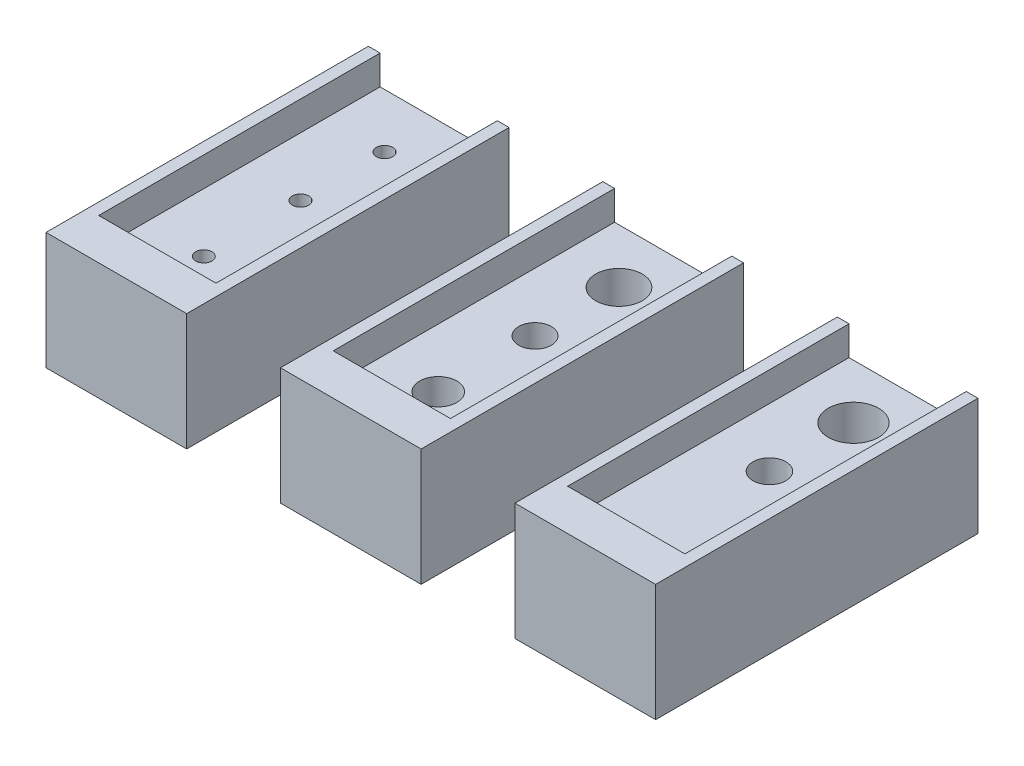
ISO-10303-21;
HEADER;
FILE_DESCRIPTION(('STEP AP214'),'2;1');
FILE_NAME('part.step','',(''),(''),'','','');
FILE_SCHEMA(('AUTOMOTIVE_DESIGN { 1 0 10303 214 1 1 1 1 }'));
ENDSEC;
DATA;
#1=APPLICATION_CONTEXT('core data for automotive mechanical design processes');
#2=APPLICATION_PROTOCOL_DEFINITION('international standard','automotive_design',2000,#1);
#3=PRODUCT_CONTEXT('',#1,'mechanical');
#4=PRODUCT('Part','Part','',(#3));
#5=PRODUCT_RELATED_PRODUCT_CATEGORY('part','',(#4));
#6=PRODUCT_DEFINITION_FORMATION('','',#4);
#7=PRODUCT_DEFINITION_CONTEXT('part definition',#1,'design');
#8=PRODUCT_DEFINITION('design','',#6,#7);
#9=PRODUCT_DEFINITION_SHAPE('','',#8);
#10=(LENGTH_UNIT() NAMED_UNIT(*) SI_UNIT(.MILLI.,.METRE.));
#11=(NAMED_UNIT(*) PLANE_ANGLE_UNIT() SI_UNIT($,.RADIAN.));
#12=(NAMED_UNIT(*) SI_UNIT($,.STERADIAN.) SOLID_ANGLE_UNIT());
#13=UNCERTAINTY_MEASURE_WITH_UNIT(LENGTH_MEASURE(1.E-05),#10,'distance_accuracy_value','');
#14=(GEOMETRIC_REPRESENTATION_CONTEXT(3) GLOBAL_UNCERTAINTY_ASSIGNED_CONTEXT((#13)) GLOBAL_UNIT_ASSIGNED_CONTEXT((#10,
#11,#12)) REPRESENTATION_CONTEXT('',''));
#15=CARTESIAN_POINT('',(0.,0.,0.));
#16=DIRECTION('',(0.,0.,1.));
#17=DIRECTION('',(1.,0.,0.));
#18=AXIS2_PLACEMENT_3D('',#15,#16,#17);
#19=CARTESIAN_POINT('',(0.,15.,0.));
#20=DIRECTION('',(0.,-1.,0.));
#21=DIRECTION('',(0.,0.,-1.));
#22=AXIS2_PLACEMENT_3D('',#19,#20,#21);
#23=PLANE('',#22);
#24=CARTESIAN_POINT('',(-30.,15.,-14.92));
#25=DIRECTION('',(0.,1.,0.));
#26=DIRECTION('',(0.,0.,1.));
#27=AXIS2_PLACEMENT_3D('',#24,#25,#26);
#28=CIRCLE('',#27,1.385);
#29=CARTESIAN_POINT('',(-30.,15.,-13.535));
#30=VERTEX_POINT('',#29);
#31=EDGE_CURVE('E173',#30,#30,#28,.T.);
#32=ORIENTED_EDGE('',*,*,#31,.F.);
#33=EDGE_LOOP('',(#32));
#34=FACE_BOUND('',#33,.T.);
#35=CARTESIAN_POINT('',(-30.,15.,-31.42));
#36=DIRECTION('',(0.,1.,0.));
#37=DIRECTION('',(0.,0.,1.));
#38=AXIS2_PLACEMENT_3D('',#35,#36,#37);
#39=CIRCLE('',#38,1.385);
#40=CARTESIAN_POINT('',(-30.,15.,-30.035));
#41=VERTEX_POINT('',#40);
#42=EDGE_CURVE('E184',#41,#41,#39,.T.);
#43=ORIENTED_EDGE('',*,*,#42,.F.);
#44=EDGE_LOOP('',(#43));
#45=FACE_BOUND('',#44,.T.);
#46=CARTESIAN_POINT('',(-30.,15.,-45.75));
#47=DIRECTION('',(0.,1.,0.));
#48=DIRECTION('',(0.,0.,1.));
#49=AXIS2_PLACEMENT_3D('',#46,#47,#48);
#50=CIRCLE('',#49,1.385);
#51=CARTESIAN_POINT('',(-30.,15.,-44.365));
#52=VERTEX_POINT('',#51);
#53=EDGE_CURVE('E178',#52,#52,#50,.T.);
#54=ORIENTED_EDGE('',*,*,#53,.F.);
#55=EDGE_LOOP('',(#54));
#56=FACE_BOUND('',#55,.T.);
#57=DIRECTION('',(-1.,0.,0.));
#58=VECTOR('',#57,1.);
#59=CARTESIAN_POINT('',(-40.,15.,-6.99999999999999));
#60=LINE('',#59,#58);
#61=CARTESIAN_POINT('',(-20.,15.,-6.99999999999999));
#62=VERTEX_POINT('',#61);
#63=CARTESIAN_POINT('',(-40.,15.,-6.99999999999999));
#64=VERTEX_POINT('',#63);
#65=EDGE_CURVE('E149',#62,#64,#60,.T.);
#66=ORIENTED_EDGE('',*,*,#65,.F.);
#67=DIRECTION('',(0.,0.,-1.));
#68=VECTOR('',#67,1.);
#69=CARTESIAN_POINT('',(-20.,15.,0.));
#70=LINE('',#69,#68);
#71=CARTESIAN_POINT('',(-20.,15.,-55.));
#72=VERTEX_POINT('',#71);
#73=EDGE_CURVE('E53',#62,#72,#70,.T.);
#74=ORIENTED_EDGE('',*,*,#73,.T.);
#75=DIRECTION('',(-1.,0.,0.));
#76=VECTOR('',#75,1.);
#77=CARTESIAN_POINT('',(-40.,15.,-55.));
#78=LINE('',#77,#76);
#79=CARTESIAN_POINT('',(-40.,15.,-55.));
#80=VERTEX_POINT('',#79);
#81=EDGE_CURVE('E12',#72,#80,#78,.T.);
#82=ORIENTED_EDGE('',*,*,#81,.T.);
#83=DIRECTION('',(0.,0.,1.));
#84=VECTOR('',#83,1.);
#85=CARTESIAN_POINT('',(-40.,15.,0.));
#86=LINE('',#85,#84);
#87=EDGE_CURVE('E192',#80,#64,#86,.T.);
#88=ORIENTED_EDGE('',*,*,#87,.T.);
#89=EDGE_LOOP('',(#66,#74,#82,#88));
#90=FACE_BOUND('',#89,.T.);
#91=ADVANCED_FACE('F44',(#34,#45,#56,#90),#23,.F.);
#92=CARTESIAN_POINT('',(-40.,15.,0.));
#93=DIRECTION('',(0.,0.,-1.));
#94=DIRECTION('',(-1.,0.,0.));
#95=AXIS2_PLACEMENT_3D('',#92,#93,#94);
#96=PLANE('',#95);
#97=DIRECTION('',(1.,0.,0.));
#98=VECTOR('',#97,1.);
#99=CARTESIAN_POINT('',(-40.,0.,0.));
#100=LINE('',#99,#98);
#101=CARTESIAN_POINT('',(-42.,0.,0.));
#102=VERTEX_POINT('',#101);
#103=CARTESIAN_POINT('',(-18.,0.,0.));
#104=VERTEX_POINT('',#103);
#105=EDGE_CURVE('E177',#102,#104,#100,.T.);
#106=ORIENTED_EDGE('',*,*,#105,.T.);
#107=DIRECTION('',(0.,-1.,0.));
#108=VECTOR('',#107,1.);
#109=CARTESIAN_POINT('',(-18.,75.0363516232681,0.));
#110=LINE('',#109,#108);
#111=CARTESIAN_POINT('',(-18.,20.,0.));
#112=VERTEX_POINT('',#111);
#113=EDGE_CURVE('E123',#112,#104,#110,.T.);
#114=ORIENTED_EDGE('',*,*,#113,.F.);
#115=DIRECTION('',(1.,0.,0.));
#116=VECTOR('',#115,1.);
#117=CARTESIAN_POINT('',(-40.,20.,0.));
#118=LINE('',#117,#116);
#119=CARTESIAN_POINT('',(-42.,20.,0.));
#120=VERTEX_POINT('',#119);
#121=EDGE_CURVE('E119',#120,#112,#118,.T.);
#122=ORIENTED_EDGE('',*,*,#121,.F.);
#123=DIRECTION('',(0.,-1.,0.));
#124=VECTOR('',#123,1.);
#125=CARTESIAN_POINT('',(-42.,75.0363516232681,0.));
#126=LINE('',#125,#124);
#127=EDGE_CURVE('E146',#120,#102,#126,.T.);
#128=ORIENTED_EDGE('',*,*,#127,.T.);
#129=EDGE_LOOP('',(#106,#114,#122,#128));
#130=FACE_BOUND('',#129,.T.);
#131=ADVANCED_FACE('F46',(#130),#96,.F.);
#132=CARTESIAN_POINT('',(-40.,15.,-55.));
#133=DIRECTION('',(0.,0.,1.));
#134=DIRECTION('',(1.,0.,0.));
#135=AXIS2_PLACEMENT_3D('',#132,#133,#134);
#136=PLANE('',#135);
#137=DIRECTION('',(-1.,0.,0.));
#138=VECTOR('',#137,1.);
#139=CARTESIAN_POINT('',(-40.,0.,-55.));
#140=LINE('',#139,#138);
#141=CARTESIAN_POINT('',(-18.,0.,-55.));
#142=VERTEX_POINT('',#141);
#143=CARTESIAN_POINT('',(-42.,0.,-55.));
#144=VERTEX_POINT('',#143);
#145=EDGE_CURVE('E48',#142,#144,#140,.T.);
#146=ORIENTED_EDGE('',*,*,#145,.T.);
#147=DIRECTION('',(0.,-1.,0.));
#148=VECTOR('',#147,1.);
#149=CARTESIAN_POINT('',(-42.,75.0363516232681,-55.));
#150=LINE('',#149,#148);
#151=CARTESIAN_POINT('',(-42.,20.,-55.));
#152=VERTEX_POINT('',#151);
#153=EDGE_CURVE('E154',#152,#144,#150,.T.);
#154=ORIENTED_EDGE('',*,*,#153,.F.);
#155=DIRECTION('',(1.,0.,0.));
#156=VECTOR('',#155,1.);
#157=CARTESIAN_POINT('',(-40.,20.,-55.));
#158=LINE('',#157,#156);
#159=CARTESIAN_POINT('',(-40.,20.,-55.));
#160=VERTEX_POINT('',#159);
#161=EDGE_CURVE('E151',#152,#160,#158,.T.);
#162=ORIENTED_EDGE('',*,*,#161,.T.);
#163=DIRECTION('',(0.,-1.,0.));
#164=VECTOR('',#163,1.);
#165=CARTESIAN_POINT('',(-40.,75.0363516232681,-55.));
#166=LINE('',#165,#164);
#167=EDGE_CURVE('E150',#160,#80,#166,.T.);
#168=ORIENTED_EDGE('',*,*,#167,.T.);
#169=ORIENTED_EDGE('',*,*,#81,.F.);
#170=DIRECTION('',(0.,-1.,0.));
#171=VECTOR('',#170,1.);
#172=CARTESIAN_POINT('',(-20.,75.0363516232681,-55.));
#173=LINE('',#172,#171);
#174=CARTESIAN_POINT('',(-20.,20.,-55.));
#175=VERTEX_POINT('',#174);
#176=EDGE_CURVE('E135',#175,#72,#173,.T.);
#177=ORIENTED_EDGE('',*,*,#176,.F.);
#178=DIRECTION('',(1.,0.,0.));
#179=VECTOR('',#178,1.);
#180=CARTESIAN_POINT('',(-20.,20.,-55.));
#181=LINE('',#180,#179);
#182=CARTESIAN_POINT('',(-18.,20.,-55.));
#183=VERTEX_POINT('',#182);
#184=EDGE_CURVE('E116',#175,#183,#181,.T.);
#185=ORIENTED_EDGE('',*,*,#184,.T.);
#186=DIRECTION('',(0.,-1.,0.));
#187=VECTOR('',#186,1.);
#188=CARTESIAN_POINT('',(-18.,75.0363516232681,-55.));
#189=LINE('',#188,#187);
#190=EDGE_CURVE('E124',#183,#142,#189,.T.);
#191=ORIENTED_EDGE('',*,*,#190,.T.);
#192=EDGE_LOOP('',(#146,#154,#162,#168,#169,#177,#185,#191));
#193=FACE_BOUND('',#192,.T.);
#194=ADVANCED_FACE('F133',(#193),#136,.F.);
#195=CARTESIAN_POINT('',(0.,0.,0.));
#196=DIRECTION('',(0.,-1.,0.));
#197=DIRECTION('',(0.,0.,-1.));
#198=AXIS2_PLACEMENT_3D('',#195,#196,#197);
#199=PLANE('',#198);
#200=CARTESIAN_POINT('',(-30.,0.,-45.75));
#201=DIRECTION('',(0.,1.,0.));
#202=DIRECTION('',(0.,0.,1.));
#203=AXIS2_PLACEMENT_3D('',#200,#201,#202);
#204=CIRCLE('',#203,1.385);
#205=CARTESIAN_POINT('',(-30.,0.,-44.365));
#206=VERTEX_POINT('',#205);
#207=EDGE_CURVE('E174',#206,#206,#204,.T.);
#208=ORIENTED_EDGE('',*,*,#207,.T.);
#209=EDGE_LOOP('',(#208));
#210=FACE_BOUND('',#209,.T.);
#211=CARTESIAN_POINT('',(-30.,0.,-31.42));
#212=DIRECTION('',(0.,1.,0.));
#213=DIRECTION('',(0.,0.,1.));
#214=AXIS2_PLACEMENT_3D('',#211,#212,#213);
#215=CIRCLE('',#214,1.385);
#216=CARTESIAN_POINT('',(-30.,0.,-30.035));
#217=VERTEX_POINT('',#216);
#218=EDGE_CURVE('E181',#217,#217,#215,.T.);
#219=ORIENTED_EDGE('',*,*,#218,.T.);
#220=EDGE_LOOP('',(#219));
#221=FACE_BOUND('',#220,.T.);
#222=CARTESIAN_POINT('',(-30.,0.,-14.92));
#223=DIRECTION('',(0.,1.,0.));
#224=DIRECTION('',(0.,0.,1.));
#225=AXIS2_PLACEMENT_3D('',#222,#223,#224);
#226=CIRCLE('',#225,1.385);
#227=CARTESIAN_POINT('',(-30.,0.,-13.535));
#228=VERTEX_POINT('',#227);
#229=EDGE_CURVE('E187',#228,#228,#226,.T.);
#230=ORIENTED_EDGE('',*,*,#229,.T.);
#231=EDGE_LOOP('',(#230));
#232=FACE_BOUND('',#231,.T.);
#233=ORIENTED_EDGE('',*,*,#105,.F.);
#234=DIRECTION('',(0.,0.,-1.));
#235=VECTOR('',#234,1.);
#236=CARTESIAN_POINT('',(-42.,0.,0.));
#237=LINE('',#236,#235);
#238=EDGE_CURVE('E143',#102,#144,#237,.T.);
#239=ORIENTED_EDGE('',*,*,#238,.T.);
#240=ORIENTED_EDGE('',*,*,#145,.F.);
#241=DIRECTION('',(0.,0.,1.));
#242=VECTOR('',#241,1.);
#243=CARTESIAN_POINT('',(-18.,0.,0.));
#244=LINE('',#243,#242);
#245=EDGE_CURVE('E130',#142,#104,#244,.T.);
#246=ORIENTED_EDGE('',*,*,#245,.T.);
#247=EDGE_LOOP('',(#233,#239,#240,#246));
#248=FACE_BOUND('',#247,.T.);
#249=ADVANCED_FACE('F201',(#210,#221,#232,#248),#199,.T.);
#250=CARTESIAN_POINT('',(-30.,0.,-14.92));
#251=DIRECTION('',(0.,1.,0.));
#252=DIRECTION('',(0.,0.,1.));
#253=AXIS2_PLACEMENT_3D('',#250,#251,#252);
#254=CYLINDRICAL_SURFACE('',#253,1.385);
#255=ORIENTED_EDGE('',*,*,#229,.F.);
#256=EDGE_LOOP('',(#255));
#257=FACE_BOUND('',#256,.T.);
#258=ORIENTED_EDGE('',*,*,#31,.T.);
#259=EDGE_LOOP('',(#258));
#260=FACE_BOUND('',#259,.T.);
#261=ADVANCED_FACE('F227',(#257,#260),#254,.F.);
#262=CARTESIAN_POINT('',(-30.,0.,-31.42));
#263=DIRECTION('',(0.,1.,0.));
#264=DIRECTION('',(0.,0.,1.));
#265=AXIS2_PLACEMENT_3D('',#262,#263,#264);
#266=CYLINDRICAL_SURFACE('',#265,1.385);
#267=ORIENTED_EDGE('',*,*,#218,.F.);
#268=EDGE_LOOP('',(#267));
#269=FACE_BOUND('',#268,.T.);
#270=ORIENTED_EDGE('',*,*,#42,.T.);
#271=EDGE_LOOP('',(#270));
#272=FACE_BOUND('',#271,.T.);
#273=ADVANCED_FACE('F247',(#269,#272),#266,.F.);
#274=CARTESIAN_POINT('',(-30.,0.,-45.75));
#275=DIRECTION('',(0.,1.,0.));
#276=DIRECTION('',(0.,0.,1.));
#277=AXIS2_PLACEMENT_3D('',#274,#275,#276);
#278=CYLINDRICAL_SURFACE('',#277,1.385);
#279=ORIENTED_EDGE('',*,*,#207,.F.);
#280=EDGE_LOOP('',(#279));
#281=FACE_BOUND('',#280,.T.);
#282=ORIENTED_EDGE('',*,*,#53,.T.);
#283=EDGE_LOOP('',(#282));
#284=FACE_BOUND('',#283,.T.);
#285=ADVANCED_FACE('F254',(#281,#284),#278,.F.);
#286=CARTESIAN_POINT('',(-40.,20.,-6.99999999999999));
#287=DIRECTION('',(0.,0.,1.));
#288=DIRECTION('',(1.,0.,0.));
#289=AXIS2_PLACEMENT_3D('',#286,#287,#288);
#290=PLANE('',#289);
#291=ORIENTED_EDGE('',*,*,#65,.T.);
#292=DIRECTION('',(0.,-1.,0.));
#293=VECTOR('',#292,1.);
#294=CARTESIAN_POINT('',(-40.,20.,-6.99999999999999));
#295=LINE('',#294,#293);
#296=CARTESIAN_POINT('',(-40.,20.,-6.99999999999999));
#297=VERTEX_POINT('',#296);
#298=EDGE_CURVE('E68',#297,#64,#295,.T.);
#299=ORIENTED_EDGE('',*,*,#298,.F.);
#300=DIRECTION('',(-1.,0.,0.));
#301=VECTOR('',#300,1.);
#302=CARTESIAN_POINT('',(-40.,20.,-6.99999999999999));
#303=LINE('',#302,#301);
#304=CARTESIAN_POINT('',(-20.,20.,-6.99999999999999));
#305=VERTEX_POINT('',#304);
#306=EDGE_CURVE('E165',#305,#297,#303,.T.);
#307=ORIENTED_EDGE('',*,*,#306,.F.);
#308=DIRECTION('',(0.,-1.,0.));
#309=VECTOR('',#308,1.);
#310=CARTESIAN_POINT('',(-20.,20.,-6.99999999999999));
#311=LINE('',#310,#309);
#312=EDGE_CURVE('E170',#305,#62,#311,.T.);
#313=ORIENTED_EDGE('',*,*,#312,.T.);
#314=EDGE_LOOP('',(#291,#299,#307,#313));
#315=FACE_BOUND('',#314,.T.);
#316=ADVANCED_FACE('F206',(#315),#290,.F.);
#317=CARTESIAN_POINT('',(0.,20.,0.));
#318=DIRECTION('',(0.,1.,0.));
#319=DIRECTION('',(0.,0.,1.));
#320=AXIS2_PLACEMENT_3D('',#317,#318,#319);
#321=PLANE('',#320);
#322=ORIENTED_EDGE('',*,*,#306,.T.);
#323=DIRECTION('',(0.,0.,1.));
#324=VECTOR('',#323,1.);
#325=CARTESIAN_POINT('',(-40.,20.,0.));
#326=LINE('',#325,#324);
#327=EDGE_CURVE('E147',#160,#297,#326,.T.);
#328=ORIENTED_EDGE('',*,*,#327,.F.);
#329=ORIENTED_EDGE('',*,*,#161,.F.);
#330=DIRECTION('',(0.,0.,-1.));
#331=VECTOR('',#330,1.);
#332=CARTESIAN_POINT('',(-42.,20.,0.));
#333=LINE('',#332,#331);
#334=EDGE_CURVE('E155',#120,#152,#333,.T.);
#335=ORIENTED_EDGE('',*,*,#334,.F.);
#336=ORIENTED_EDGE('',*,*,#121,.T.);
#337=DIRECTION('',(0.,0.,1.));
#338=VECTOR('',#337,1.);
#339=CARTESIAN_POINT('',(-18.,20.,0.));
#340=LINE('',#339,#338);
#341=EDGE_CURVE('E110',#183,#112,#340,.T.);
#342=ORIENTED_EDGE('',*,*,#341,.F.);
#343=ORIENTED_EDGE('',*,*,#184,.F.);
#344=DIRECTION('',(0.,0.,-1.));
#345=VECTOR('',#344,1.);
#346=CARTESIAN_POINT('',(-20.,20.,0.));
#347=LINE('',#346,#345);
#348=EDGE_CURVE('E139',#305,#175,#347,.T.);
#349=ORIENTED_EDGE('',*,*,#348,.F.);
#350=EDGE_LOOP('',(#322,#328,#329,#335,#336,#342,#343,#349));
#351=FACE_BOUND('',#350,.T.);
#352=ADVANCED_FACE('F113',(#351),#321,.T.);
#353=CARTESIAN_POINT('',(-42.,75.0363516232681,0.));
#354=DIRECTION('',(-1.,0.,0.));
#355=DIRECTION('',(0.,0.,1.));
#356=AXIS2_PLACEMENT_3D('',#353,#354,#355);
#357=PLANE('',#356);
#358=ORIENTED_EDGE('',*,*,#127,.F.);
#359=ORIENTED_EDGE('',*,*,#334,.T.);
#360=ORIENTED_EDGE('',*,*,#153,.T.);
#361=ORIENTED_EDGE('',*,*,#238,.F.);
#362=EDGE_LOOP('',(#358,#359,#360,#361));
#363=FACE_BOUND('',#362,.T.);
#364=ADVANCED_FACE('F200',(#363),#357,.T.);
#365=CARTESIAN_POINT('',(-40.,75.0363516232681,0.));
#366=DIRECTION('',(1.,0.,0.));
#367=DIRECTION('',(0.,0.,-1.));
#368=AXIS2_PLACEMENT_3D('',#365,#366,#367);
#369=PLANE('',#368);
#370=ORIENTED_EDGE('',*,*,#327,.T.);
#371=ORIENTED_EDGE('',*,*,#298,.T.);
#372=ORIENTED_EDGE('',*,*,#87,.F.);
#373=ORIENTED_EDGE('',*,*,#167,.F.);
#374=EDGE_LOOP('',(#370,#371,#372,#373));
#375=FACE_BOUND('',#374,.T.);
#376=ADVANCED_FACE('F209',(#375),#369,.T.);
#377=CARTESIAN_POINT('',(-20.,75.0363516232681,0.));
#378=DIRECTION('',(-1.,0.,0.));
#379=DIRECTION('',(0.,0.,1.));
#380=AXIS2_PLACEMENT_3D('',#377,#378,#379);
#381=PLANE('',#380);
#382=ORIENTED_EDGE('',*,*,#73,.F.);
#383=ORIENTED_EDGE('',*,*,#312,.F.);
#384=ORIENTED_EDGE('',*,*,#348,.T.);
#385=ORIENTED_EDGE('',*,*,#176,.T.);
#386=EDGE_LOOP('',(#382,#383,#384,#385));
#387=FACE_BOUND('',#386,.T.);
#388=ADVANCED_FACE('F207',(#387),#381,.T.);
#389=CARTESIAN_POINT('',(-18.,75.0363516232681,0.));
#390=DIRECTION('',(1.,0.,0.));
#391=DIRECTION('',(0.,0.,-1.));
#392=AXIS2_PLACEMENT_3D('',#389,#390,#391);
#393=PLANE('',#392);
#394=ORIENTED_EDGE('',*,*,#190,.F.);
#395=ORIENTED_EDGE('',*,*,#341,.T.);
#396=ORIENTED_EDGE('',*,*,#113,.T.);
#397=ORIENTED_EDGE('',*,*,#245,.F.);
#398=EDGE_LOOP('',(#394,#395,#396,#397));
#399=FACE_BOUND('',#398,.T.);
#400=ADVANCED_FACE('F128',(#399),#393,.T.);
#401=CLOSED_SHELL('',(#91,#131,#194,#249,#261,#273,#285,#316,#352,#364,#376,#388,#400));
#402=MANIFOLD_SOLID_BREP('B2',#401);
#403=CARTESIAN_POINT('',(0.,15.,0.));
#404=DIRECTION('',(0.,-1.,0.));
#405=DIRECTION('',(0.,0.,-1.));
#406=AXIS2_PLACEMENT_3D('',#403,#404,#405);
#407=PLANE('',#406);
#408=CARTESIAN_POINT('',(50.,15.,-31.42));
#409=DIRECTION('',(0.,1.,0.));
#410=DIRECTION('',(0.,0.,1.));
#411=AXIS2_PLACEMENT_3D('',#408,#409,#410);
#412=CIRCLE('',#411,2.80670000000001);
#413=CARTESIAN_POINT('',(50.,15.,-28.6133));
#414=VERTEX_POINT('',#413);
#415=EDGE_CURVE('E500',#414,#414,#412,.T.);
#416=ORIENTED_EDGE('',*,*,#415,.F.);
#417=EDGE_LOOP('',(#416));
#418=FACE_BOUND('',#417,.T.);
#419=CARTESIAN_POINT('',(50.,15.,-45.75));
#420=DIRECTION('',(0.,1.,0.));
#421=DIRECTION('',(0.,0.,1.));
#422=AXIS2_PLACEMENT_3D('',#419,#420,#421);
#423=CIRCLE('',#422,4.3053);
#424=CARTESIAN_POINT('',(50.,15.,-41.4447));
#425=VERTEX_POINT('',#424);
#426=EDGE_CURVE('E505',#425,#425,#423,.T.);
#427=ORIENTED_EDGE('',*,*,#426,.F.);
#428=EDGE_LOOP('',(#427));
#429=FACE_BOUND('',#428,.T.);
#430=DIRECTION('',(-1.,0.,0.));
#431=VECTOR('',#430,1.);
#432=CARTESIAN_POINT('',(40.,15.,-6.99999999999999));
#433=LINE('',#432,#431);
#434=CARTESIAN_POINT('',(60.,15.,-6.99999999999999));
#435=VERTEX_POINT('',#434);
#436=CARTESIAN_POINT('',(40.,15.,-6.99999999999999));
#437=VERTEX_POINT('',#436);
#438=EDGE_CURVE('E476',#435,#437,#433,.T.);
#439=ORIENTED_EDGE('',*,*,#438,.F.);
#440=DIRECTION('',(0.,0.,-1.));
#441=VECTOR('',#440,1.);
#442=CARTESIAN_POINT('',(60.,15.,0.));
#443=LINE('',#442,#441);
#444=CARTESIAN_POINT('',(60.,15.,-55.));
#445=VERTEX_POINT('',#444);
#446=EDGE_CURVE('E380',#435,#445,#443,.T.);
#447=ORIENTED_EDGE('',*,*,#446,.T.);
#448=DIRECTION('',(-1.,0.,0.));
#449=VECTOR('',#448,1.);
#450=CARTESIAN_POINT('',(40.,15.,-55.));
#451=LINE('',#450,#449);
#452=CARTESIAN_POINT('',(40.,15.,-55.));
#453=VERTEX_POINT('',#452);
#454=EDGE_CURVE('E42',#445,#453,#451,.T.);
#455=ORIENTED_EDGE('',*,*,#454,.T.);
#456=DIRECTION('',(0.,0.,1.));
#457=VECTOR('',#456,1.);
#458=CARTESIAN_POINT('',(40.,15.,0.));
#459=LINE('',#458,#457);
#460=EDGE_CURVE('E513',#453,#437,#459,.T.);
#461=ORIENTED_EDGE('',*,*,#460,.T.);
#462=EDGE_LOOP('',(#439,#447,#455,#461));
#463=FACE_BOUND('',#462,.T.);
#464=ADVANCED_FACE('F371',(#418,#429,#463),#407,.F.);
#465=CARTESIAN_POINT('',(40.,15.,0.));
#466=DIRECTION('',(0.,0.,-1.));
#467=DIRECTION('',(-1.,0.,0.));
#468=AXIS2_PLACEMENT_3D('',#465,#466,#467);
#469=PLANE('',#468);
#470=DIRECTION('',(1.,0.,0.));
#471=VECTOR('',#470,1.);
#472=CARTESIAN_POINT('',(40.,0.,0.));
#473=LINE('',#472,#471);
#474=CARTESIAN_POINT('',(38.,0.,0.));
#475=VERTEX_POINT('',#474);
#476=CARTESIAN_POINT('',(62.,0.,0.));
#477=VERTEX_POINT('',#476);
#478=EDGE_CURVE('E504',#475,#477,#473,.T.);
#479=ORIENTED_EDGE('',*,*,#478,.T.);
#480=DIRECTION('',(0.,-1.,0.));
#481=VECTOR('',#480,1.);
#482=CARTESIAN_POINT('',(62.,75.0363516232681,0.));
#483=LINE('',#482,#481);
#484=CARTESIAN_POINT('',(62.,20.,0.));
#485=VERTEX_POINT('',#484);
#486=EDGE_CURVE('E450',#485,#477,#483,.T.);
#487=ORIENTED_EDGE('',*,*,#486,.F.);
#488=DIRECTION('',(1.,0.,0.));
#489=VECTOR('',#488,1.);
#490=CARTESIAN_POINT('',(40.,20.,0.));
#491=LINE('',#490,#489);
#492=CARTESIAN_POINT('',(38.,20.,0.));
#493=VERTEX_POINT('',#492);
#494=EDGE_CURVE('E446',#493,#485,#491,.T.);
#495=ORIENTED_EDGE('',*,*,#494,.F.);
#496=DIRECTION('',(0.,-1.,0.));
#497=VECTOR('',#496,1.);
#498=CARTESIAN_POINT('',(38.,75.0363516232681,0.));
#499=LINE('',#498,#497);
#500=EDGE_CURVE('E473',#493,#475,#499,.T.);
#501=ORIENTED_EDGE('',*,*,#500,.T.);
#502=EDGE_LOOP('',(#479,#487,#495,#501));
#503=FACE_BOUND('',#502,.T.);
#504=ADVANCED_FACE('F373',(#503),#469,.F.);
#505=CARTESIAN_POINT('',(40.,15.,-55.));
#506=DIRECTION('',(0.,0.,1.));
#507=DIRECTION('',(1.,0.,0.));
#508=AXIS2_PLACEMENT_3D('',#505,#506,#507);
#509=PLANE('',#508);
#510=DIRECTION('',(-1.,0.,0.));
#511=VECTOR('',#510,1.);
#512=CARTESIAN_POINT('',(40.,0.,-55.));
#513=LINE('',#512,#511);
#514=CARTESIAN_POINT('',(62.,0.,-55.));
#515=VERTEX_POINT('',#514);
#516=CARTESIAN_POINT('',(38.,0.,-55.));
#517=VERTEX_POINT('',#516);
#518=EDGE_CURVE('E375',#515,#517,#513,.T.);
#519=ORIENTED_EDGE('',*,*,#518,.T.);
#520=DIRECTION('',(0.,-1.,0.));
#521=VECTOR('',#520,1.);
#522=CARTESIAN_POINT('',(38.,75.0363516232681,-55.));
#523=LINE('',#522,#521);
#524=CARTESIAN_POINT('',(38.,20.,-55.));
#525=VERTEX_POINT('',#524);
#526=EDGE_CURVE('E481',#525,#517,#523,.T.);
#527=ORIENTED_EDGE('',*,*,#526,.F.);
#528=DIRECTION('',(1.,0.,0.));
#529=VECTOR('',#528,1.);
#530=CARTESIAN_POINT('',(40.,20.,-55.));
#531=LINE('',#530,#529);
#532=CARTESIAN_POINT('',(40.,20.,-55.));
#533=VERTEX_POINT('',#532);
#534=EDGE_CURVE('E478',#525,#533,#531,.T.);
#535=ORIENTED_EDGE('',*,*,#534,.T.);
#536=DIRECTION('',(0.,-1.,0.));
#537=VECTOR('',#536,1.);
#538=CARTESIAN_POINT('',(40.,75.0363516232681,-55.));
#539=LINE('',#538,#537);
#540=EDGE_CURVE('E477',#533,#453,#539,.T.);
#541=ORIENTED_EDGE('',*,*,#540,.T.);
#542=ORIENTED_EDGE('',*,*,#454,.F.);
#543=DIRECTION('',(0.,-1.,0.));
#544=VECTOR('',#543,1.);
#545=CARTESIAN_POINT('',(60.,75.0363516232681,-55.));
#546=LINE('',#545,#544);
#547=CARTESIAN_POINT('',(60.,20.,-55.));
#548=VERTEX_POINT('',#547);
#549=EDGE_CURVE('E462',#548,#445,#546,.T.);
#550=ORIENTED_EDGE('',*,*,#549,.F.);
#551=DIRECTION('',(1.,0.,0.));
#552=VECTOR('',#551,1.);
#553=CARTESIAN_POINT('',(60.,20.,-55.));
#554=LINE('',#553,#552);
#555=CARTESIAN_POINT('',(62.,20.,-55.));
#556=VERTEX_POINT('',#555);
#557=EDGE_CURVE('E443',#548,#556,#554,.T.);
#558=ORIENTED_EDGE('',*,*,#557,.T.);
#559=DIRECTION('',(0.,-1.,0.));
#560=VECTOR('',#559,1.);
#561=CARTESIAN_POINT('',(62.,75.0363516232681,-55.));
#562=LINE('',#561,#560);
#563=EDGE_CURVE('E451',#556,#515,#562,.T.);
#564=ORIENTED_EDGE('',*,*,#563,.T.);
#565=EDGE_LOOP('',(#519,#527,#535,#541,#542,#550,#558,#564));
#566=FACE_BOUND('',#565,.T.);
#567=ADVANCED_FACE('F460',(#566),#509,.F.);
#568=CARTESIAN_POINT('',(0.,0.,0.));
#569=DIRECTION('',(0.,-1.,0.));
#570=DIRECTION('',(0.,0.,-1.));
#571=AXIS2_PLACEMENT_3D('',#568,#569,#570);
#572=PLANE('',#571);
#573=CARTESIAN_POINT('',(50.,0.,-45.75));
#574=DIRECTION('',(0.,1.,0.));
#575=DIRECTION('',(0.,0.,1.));
#576=AXIS2_PLACEMENT_3D('',#573,#574,#575);
#577=CIRCLE('',#576,4.3053);
#578=CARTESIAN_POINT('',(50.,0.,-41.4447));
#579=VERTEX_POINT('',#578);
#580=EDGE_CURVE('E501',#579,#579,#577,.T.);
#581=ORIENTED_EDGE('',*,*,#580,.T.);
#582=EDGE_LOOP('',(#581));
#583=FACE_BOUND('',#582,.T.);
#584=CARTESIAN_POINT('',(50.,0.,-31.42));
#585=DIRECTION('',(0.,1.,0.));
#586=DIRECTION('',(0.,0.,1.));
#587=AXIS2_PLACEMENT_3D('',#584,#585,#586);
#588=CIRCLE('',#587,2.80670000000001);
#589=CARTESIAN_POINT('',(50.,0.,-28.6133));
#590=VERTEX_POINT('',#589);
#591=EDGE_CURVE('E508',#590,#590,#588,.T.);
#592=ORIENTED_EDGE('',*,*,#591,.T.);
#593=EDGE_LOOP('',(#592));
#594=FACE_BOUND('',#593,.T.);
#595=ORIENTED_EDGE('',*,*,#478,.F.);
#596=DIRECTION('',(0.,0.,-1.));
#597=VECTOR('',#596,1.);
#598=CARTESIAN_POINT('',(38.,0.,0.));
#599=LINE('',#598,#597);
#600=EDGE_CURVE('E470',#475,#517,#599,.T.);
#601=ORIENTED_EDGE('',*,*,#600,.T.);
#602=ORIENTED_EDGE('',*,*,#518,.F.);
#603=DIRECTION('',(0.,0.,1.));
#604=VECTOR('',#603,1.);
#605=CARTESIAN_POINT('',(62.,0.,0.));
#606=LINE('',#605,#604);
#607=EDGE_CURVE('E457',#515,#477,#606,.T.);
#608=ORIENTED_EDGE('',*,*,#607,.T.);
#609=EDGE_LOOP('',(#595,#601,#602,#608));
#610=FACE_BOUND('',#609,.T.);
#611=ADVANCED_FACE('F522',(#583,#594,#610),#572,.T.);
#612=CARTESIAN_POINT('',(50.,0.,-31.42));
#613=DIRECTION('',(0.,1.,0.));
#614=DIRECTION('',(0.,0.,1.));
#615=AXIS2_PLACEMENT_3D('',#612,#613,#614);
#616=CYLINDRICAL_SURFACE('',#615,2.80670000000001);
#617=ORIENTED_EDGE('',*,*,#591,.F.);
#618=EDGE_LOOP('',(#617));
#619=FACE_BOUND('',#618,.T.);
#620=ORIENTED_EDGE('',*,*,#415,.T.);
#621=EDGE_LOOP('',(#620));
#622=FACE_BOUND('',#621,.T.);
#623=ADVANCED_FACE('F548',(#619,#622),#616,.F.);
#624=CARTESIAN_POINT('',(50.,0.,-45.75));
#625=DIRECTION('',(0.,1.,0.));
#626=DIRECTION('',(0.,0.,1.));
#627=AXIS2_PLACEMENT_3D('',#624,#625,#626);
#628=CYLINDRICAL_SURFACE('',#627,4.3053);
#629=ORIENTED_EDGE('',*,*,#580,.F.);
#630=EDGE_LOOP('',(#629));
#631=FACE_BOUND('',#630,.T.);
#632=ORIENTED_EDGE('',*,*,#426,.T.);
#633=EDGE_LOOP('',(#632));
#634=FACE_BOUND('',#633,.T.);
#635=ADVANCED_FACE('F568',(#631,#634),#628,.F.);
#636=CARTESIAN_POINT('',(40.,20.,-6.99999999999999));
#637=DIRECTION('',(0.,0.,1.));
#638=DIRECTION('',(1.,0.,0.));
#639=AXIS2_PLACEMENT_3D('',#636,#637,#638);
#640=PLANE('',#639);
#641=ORIENTED_EDGE('',*,*,#438,.T.);
#642=DIRECTION('',(0.,-1.,0.));
#643=VECTOR('',#642,1.);
#644=CARTESIAN_POINT('',(40.,20.,-6.99999999999999));
#645=LINE('',#644,#643);
#646=CARTESIAN_POINT('',(40.,20.,-6.99999999999999));
#647=VERTEX_POINT('',#646);
#648=EDGE_CURVE('E395',#647,#437,#645,.T.);
#649=ORIENTED_EDGE('',*,*,#648,.F.);
#650=DIRECTION('',(-1.,0.,0.));
#651=VECTOR('',#650,1.);
#652=CARTESIAN_POINT('',(40.,20.,-6.99999999999999));
#653=LINE('',#652,#651);
#654=CARTESIAN_POINT('',(60.,20.,-6.99999999999999));
#655=VERTEX_POINT('',#654);
#656=EDGE_CURVE('E492',#655,#647,#653,.T.);
#657=ORIENTED_EDGE('',*,*,#656,.F.);
#658=DIRECTION('',(0.,-1.,0.));
#659=VECTOR('',#658,1.);
#660=CARTESIAN_POINT('',(60.,20.,-6.99999999999999));
#661=LINE('',#660,#659);
#662=EDGE_CURVE('E497',#655,#435,#661,.T.);
#663=ORIENTED_EDGE('',*,*,#662,.T.);
#664=EDGE_LOOP('',(#641,#649,#657,#663));
#665=FACE_BOUND('',#664,.T.);
#666=ADVANCED_FACE('F527',(#665),#640,.F.);
#667=CARTESIAN_POINT('',(0.,20.,0.));
#668=DIRECTION('',(0.,1.,0.));
#669=DIRECTION('',(0.,0.,1.));
#670=AXIS2_PLACEMENT_3D('',#667,#668,#669);
#671=PLANE('',#670);
#672=ORIENTED_EDGE('',*,*,#656,.T.);
#673=DIRECTION('',(0.,0.,1.));
#674=VECTOR('',#673,1.);
#675=CARTESIAN_POINT('',(40.,20.,0.));
#676=LINE('',#675,#674);
#677=EDGE_CURVE('E474',#533,#647,#676,.T.);
#678=ORIENTED_EDGE('',*,*,#677,.F.);
#679=ORIENTED_EDGE('',*,*,#534,.F.);
#680=DIRECTION('',(0.,0.,-1.));
#681=VECTOR('',#680,1.);
#682=CARTESIAN_POINT('',(38.,20.,0.));
#683=LINE('',#682,#681);
#684=EDGE_CURVE('E482',#493,#525,#683,.T.);
#685=ORIENTED_EDGE('',*,*,#684,.F.);
#686=ORIENTED_EDGE('',*,*,#494,.T.);
#687=DIRECTION('',(0.,0.,1.));
#688=VECTOR('',#687,1.);
#689=CARTESIAN_POINT('',(62.,20.,0.));
#690=LINE('',#689,#688);
#691=EDGE_CURVE('E437',#556,#485,#690,.T.);
#692=ORIENTED_EDGE('',*,*,#691,.F.);
#693=ORIENTED_EDGE('',*,*,#557,.F.);
#694=DIRECTION('',(0.,0.,-1.));
#695=VECTOR('',#694,1.);
#696=CARTESIAN_POINT('',(60.,20.,0.));
#697=LINE('',#696,#695);
#698=EDGE_CURVE('E466',#655,#548,#697,.T.);
#699=ORIENTED_EDGE('',*,*,#698,.F.);
#700=EDGE_LOOP('',(#672,#678,#679,#685,#686,#692,#693,#699));
#701=FACE_BOUND('',#700,.T.);
#702=ADVANCED_FACE('F440',(#701),#671,.T.);
#703=CARTESIAN_POINT('',(38.,75.0363516232681,0.));
#704=DIRECTION('',(-1.,0.,0.));
#705=DIRECTION('',(0.,0.,1.));
#706=AXIS2_PLACEMENT_3D('',#703,#704,#705);
#707=PLANE('',#706);
#708=ORIENTED_EDGE('',*,*,#500,.F.);
#709=ORIENTED_EDGE('',*,*,#684,.T.);
#710=ORIENTED_EDGE('',*,*,#526,.T.);
#711=ORIENTED_EDGE('',*,*,#600,.F.);
#712=EDGE_LOOP('',(#708,#709,#710,#711));
#713=FACE_BOUND('',#712,.T.);
#714=ADVANCED_FACE('F521',(#713),#707,.T.);
#715=CARTESIAN_POINT('',(40.,75.0363516232681,0.));
#716=DIRECTION('',(1.,0.,0.));
#717=DIRECTION('',(0.,0.,-1.));
#718=AXIS2_PLACEMENT_3D('',#715,#716,#717);
#719=PLANE('',#718);
#720=ORIENTED_EDGE('',*,*,#677,.T.);
#721=ORIENTED_EDGE('',*,*,#648,.T.);
#722=ORIENTED_EDGE('',*,*,#460,.F.);
#723=ORIENTED_EDGE('',*,*,#540,.F.);
#724=EDGE_LOOP('',(#720,#721,#722,#723));
#725=FACE_BOUND('',#724,.T.);
#726=ADVANCED_FACE('F530',(#725),#719,.T.);
#727=CARTESIAN_POINT('',(60.,75.0363516232681,0.));
#728=DIRECTION('',(-1.,0.,0.));
#729=DIRECTION('',(0.,0.,1.));
#730=AXIS2_PLACEMENT_3D('',#727,#728,#729);
#731=PLANE('',#730);
#732=ORIENTED_EDGE('',*,*,#446,.F.);
#733=ORIENTED_EDGE('',*,*,#662,.F.);
#734=ORIENTED_EDGE('',*,*,#698,.T.);
#735=ORIENTED_EDGE('',*,*,#549,.T.);
#736=EDGE_LOOP('',(#732,#733,#734,#735));
#737=FACE_BOUND('',#736,.T.);
#738=ADVANCED_FACE('F528',(#737),#731,.T.);
#739=CARTESIAN_POINT('',(62.,75.0363516232681,0.));
#740=DIRECTION('',(1.,0.,0.));
#741=DIRECTION('',(0.,0.,-1.));
#742=AXIS2_PLACEMENT_3D('',#739,#740,#741);
#743=PLANE('',#742);
#744=ORIENTED_EDGE('',*,*,#563,.F.);
#745=ORIENTED_EDGE('',*,*,#691,.T.);
#746=ORIENTED_EDGE('',*,*,#486,.T.);
#747=ORIENTED_EDGE('',*,*,#607,.F.);
#748=EDGE_LOOP('',(#744,#745,#746,#747));
#749=FACE_BOUND('',#748,.T.);
#750=ADVANCED_FACE('F455',(#749),#743,.T.);
#751=CLOSED_SHELL('',(#464,#504,#567,#611,#623,#635,#666,#702,#714,#726,#738,#750));
#752=MANIFOLD_SOLID_BREP('B6',#751);
#753=CARTESIAN_POINT('',(0.,15.,0.));
#754=DIRECTION('',(0.,-1.,0.));
#755=DIRECTION('',(0.,0.,-1.));
#756=AXIS2_PLACEMENT_3D('',#753,#754,#755);
#757=PLANE('',#756);
#758=CARTESIAN_POINT('',(10.,15.,-45.75));
#759=DIRECTION('',(0.,1.,0.));
#760=DIRECTION('',(0.,0.,1.));
#761=AXIS2_PLACEMENT_3D('',#758,#759,#760);
#762=CIRCLE('',#761,3.96875);
#763=CARTESIAN_POINT('',(10.,15.,-41.78125));
#764=VERTEX_POINT('',#763);
#765=EDGE_CURVE('E797',#764,#764,#762,.T.);
#766=ORIENTED_EDGE('',*,*,#765,.F.);
#767=EDGE_LOOP('',(#766));
#768=FACE_BOUND('',#767,.T.);
#769=CARTESIAN_POINT('',(10.,15.,-14.92));
#770=DIRECTION('',(0.,1.,0.));
#771=DIRECTION('',(0.,0.,1.));
#772=AXIS2_PLACEMENT_3D('',#769,#770,#771);
#773=CIRCLE('',#772,3.175);
#774=CARTESIAN_POINT('',(10.,15.,-11.745));
#775=VERTEX_POINT('',#774);
#776=EDGE_CURVE('E808',#775,#775,#773,.T.);
#777=ORIENTED_EDGE('',*,*,#776,.F.);
#778=EDGE_LOOP('',(#777));
#779=FACE_BOUND('',#778,.T.);
#780=CARTESIAN_POINT('',(10.,15.,-31.42));
#781=DIRECTION('',(0.,1.,0.));
#782=DIRECTION('',(0.,0.,1.));
#783=AXIS2_PLACEMENT_3D('',#780,#781,#782);
#784=CIRCLE('',#783,2.778125);
#785=CARTESIAN_POINT('',(10.,15.,-28.641875));
#786=VERTEX_POINT('',#785);
#787=EDGE_CURVE('E802',#786,#786,#784,.T.);
#788=ORIENTED_EDGE('',*,*,#787,.F.);
#789=EDGE_LOOP('',(#788));
#790=FACE_BOUND('',#789,.T.);
#791=DIRECTION('',(-1.,0.,0.));
#792=VECTOR('',#791,1.);
#793=CARTESIAN_POINT('',(0.,15.,-7.));
#794=LINE('',#793,#792);
#795=CARTESIAN_POINT('',(20.,15.,-7.));
#796=VERTEX_POINT('',#795);
#797=CARTESIAN_POINT('',(0.,15.,-7.));
#798=VERTEX_POINT('',#797);
#799=EDGE_CURVE('E773',#796,#798,#794,.T.);
#800=ORIENTED_EDGE('',*,*,#799,.F.);
#801=DIRECTION('',(0.,0.,-1.));
#802=VECTOR('',#801,1.);
#803=CARTESIAN_POINT('',(20.,15.,0.));
#804=LINE('',#803,#802);
#805=CARTESIAN_POINT('',(20.,15.,-55.));
#806=VERTEX_POINT('',#805);
#807=EDGE_CURVE('E677',#796,#806,#804,.T.);
#808=ORIENTED_EDGE('',*,*,#807,.T.);
#809=DIRECTION('',(-1.,0.,0.));
#810=VECTOR('',#809,1.);
#811=CARTESIAN_POINT('',(0.,15.,-55.));
#812=LINE('',#811,#810);
#813=CARTESIAN_POINT('',(0.,15.,-55.));
#814=VERTEX_POINT('',#813);
#815=EDGE_CURVE('E369',#806,#814,#812,.T.);
#816=ORIENTED_EDGE('',*,*,#815,.T.);
#817=DIRECTION('',(0.,0.,1.));
#818=VECTOR('',#817,1.);
#819=CARTESIAN_POINT('',(0.,15.,0.));
#820=LINE('',#819,#818);
#821=EDGE_CURVE('E816',#814,#798,#820,.T.);
#822=ORIENTED_EDGE('',*,*,#821,.T.);
#823=EDGE_LOOP('',(#800,#808,#816,#822));
#824=FACE_BOUND('',#823,.T.);
#825=ADVANCED_FACE('F668',(#768,#779,#790,#824),#757,.F.);
#826=CARTESIAN_POINT('',(0.,15.,0.));
#827=DIRECTION('',(0.,0.,-1.));
#828=DIRECTION('',(-1.,0.,0.));
#829=AXIS2_PLACEMENT_3D('',#826,#827,#828);
#830=PLANE('',#829);
#831=DIRECTION('',(1.,0.,0.));
#832=VECTOR('',#831,1.);
#833=CARTESIAN_POINT('',(0.,0.,0.));
#834=LINE('',#833,#832);
#835=CARTESIAN_POINT('',(-2.00000000000001,0.,0.));
#836=VERTEX_POINT('',#835);
#837=CARTESIAN_POINT('',(22.,0.,0.));
#838=VERTEX_POINT('',#837);
#839=EDGE_CURVE('E801',#836,#838,#834,.T.);
#840=ORIENTED_EDGE('',*,*,#839,.T.);
#841=DIRECTION('',(0.,-1.,0.));
#842=VECTOR('',#841,1.);
#843=CARTESIAN_POINT('',(22.,75.0363516232681,0.));
#844=LINE('',#843,#842);
#845=CARTESIAN_POINT('',(22.,20.,0.));
#846=VERTEX_POINT('',#845);
#847=EDGE_CURVE('E747',#846,#838,#844,.T.);
#848=ORIENTED_EDGE('',*,*,#847,.F.);
#849=DIRECTION('',(1.,0.,0.));
#850=VECTOR('',#849,1.);
#851=CARTESIAN_POINT('',(0.,20.,0.));
#852=LINE('',#851,#850);
#853=CARTESIAN_POINT('',(-2.00000000000001,20.,0.));
#854=VERTEX_POINT('',#853);
#855=EDGE_CURVE('E743',#854,#846,#852,.T.);
#856=ORIENTED_EDGE('',*,*,#855,.F.);
#857=DIRECTION('',(0.,-1.,0.));
#858=VECTOR('',#857,1.);
#859=CARTESIAN_POINT('',(-2.00000000000001,75.0363516232681,0.));
#860=LINE('',#859,#858);
#861=EDGE_CURVE('E770',#854,#836,#860,.T.);
#862=ORIENTED_EDGE('',*,*,#861,.T.);
#863=EDGE_LOOP('',(#840,#848,#856,#862));
#864=FACE_BOUND('',#863,.T.);
#865=ADVANCED_FACE('F670',(#864),#830,.F.);
#866=CARTESIAN_POINT('',(0.,15.,-55.));
#867=DIRECTION('',(0.,0.,1.));
#868=DIRECTION('',(1.,0.,0.));
#869=AXIS2_PLACEMENT_3D('',#866,#867,#868);
#870=PLANE('',#869);
#871=DIRECTION('',(-1.,0.,0.));
#872=VECTOR('',#871,1.);
#873=CARTESIAN_POINT('',(0.,0.,-55.));
#874=LINE('',#873,#872);
#875=CARTESIAN_POINT('',(22.,0.,-55.));
#876=VERTEX_POINT('',#875);
#877=CARTESIAN_POINT('',(-2.,0.,-55.));
#878=VERTEX_POINT('',#877);
#879=EDGE_CURVE('E672',#876,#878,#874,.T.);
#880=ORIENTED_EDGE('',*,*,#879,.T.);
#881=DIRECTION('',(0.,-1.,0.));
#882=VECTOR('',#881,1.);
#883=CARTESIAN_POINT('',(-2.,75.0363516232681,-55.));
#884=LINE('',#883,#882);
#885=CARTESIAN_POINT('',(-2.,20.,-55.));
#886=VERTEX_POINT('',#885);
#887=EDGE_CURVE('E778',#886,#878,#884,.T.);
#888=ORIENTED_EDGE('',*,*,#887,.F.);
#889=DIRECTION('',(1.,0.,0.));
#890=VECTOR('',#889,1.);
#891=CARTESIAN_POINT('',(0.,20.,-55.));
#892=LINE('',#891,#890);
#893=CARTESIAN_POINT('',(0.,20.,-55.));
#894=VERTEX_POINT('',#893);
#895=EDGE_CURVE('E775',#886,#894,#892,.T.);
#896=ORIENTED_EDGE('',*,*,#895,.T.);
#897=DIRECTION('',(0.,-1.,0.));
#898=VECTOR('',#897,1.);
#899=CARTESIAN_POINT('',(0.,75.0363516232681,-55.));
#900=LINE('',#899,#898);
#901=EDGE_CURVE('E774',#894,#814,#900,.T.);
#902=ORIENTED_EDGE('',*,*,#901,.T.);
#903=ORIENTED_EDGE('',*,*,#815,.F.);
#904=DIRECTION('',(0.,-1.,0.));
#905=VECTOR('',#904,1.);
#906=CARTESIAN_POINT('',(20.,75.0363516232681,-55.));
#907=LINE('',#906,#905);
#908=CARTESIAN_POINT('',(20.,20.,-55.));
#909=VERTEX_POINT('',#908);
#910=EDGE_CURVE('E759',#909,#806,#907,.T.);
#911=ORIENTED_EDGE('',*,*,#910,.F.);
#912=DIRECTION('',(1.,0.,0.));
#913=VECTOR('',#912,1.);
#914=CARTESIAN_POINT('',(20.,20.,-55.));
#915=LINE('',#914,#913);
#916=CARTESIAN_POINT('',(22.,20.,-55.));
#917=VERTEX_POINT('',#916);
#918=EDGE_CURVE('E740',#909,#917,#915,.T.);
#919=ORIENTED_EDGE('',*,*,#918,.T.);
#920=DIRECTION('',(0.,-1.,0.));
#921=VECTOR('',#920,1.);
#922=CARTESIAN_POINT('',(22.,75.0363516232681,-55.));
#923=LINE('',#922,#921);
#924=EDGE_CURVE('E748',#917,#876,#923,.T.);
#925=ORIENTED_EDGE('',*,*,#924,.T.);
#926=EDGE_LOOP('',(#880,#888,#896,#902,#903,#911,#919,#925));
#927=FACE_BOUND('',#926,.T.);
#928=ADVANCED_FACE('F757',(#927),#870,.F.);
#929=CARTESIAN_POINT('',(0.,0.,0.));
#930=DIRECTION('',(0.,-1.,0.));
#931=DIRECTION('',(0.,0.,-1.));
#932=AXIS2_PLACEMENT_3D('',#929,#930,#931);
#933=PLANE('',#932);
#934=CARTESIAN_POINT('',(10.,0.,-31.42));
#935=DIRECTION('',(0.,1.,0.));
#936=DIRECTION('',(0.,0.,1.));
#937=AXIS2_PLACEMENT_3D('',#934,#935,#936);
#938=CIRCLE('',#937,2.778125);
#939=CARTESIAN_POINT('',(10.,0.,-28.641875));
#940=VERTEX_POINT('',#939);
#941=EDGE_CURVE('E798',#940,#940,#938,.T.);
#942=ORIENTED_EDGE('',*,*,#941,.T.);
#943=EDGE_LOOP('',(#942));
#944=FACE_BOUND('',#943,.T.);
#945=CARTESIAN_POINT('',(10.,0.,-14.92));
#946=DIRECTION('',(0.,1.,0.));
#947=DIRECTION('',(0.,0.,1.));
#948=AXIS2_PLACEMENT_3D('',#945,#946,#947);
#949=CIRCLE('',#948,3.175);
#950=CARTESIAN_POINT('',(10.,0.,-11.745));
#951=VERTEX_POINT('',#950);
#952=EDGE_CURVE('E805',#951,#951,#949,.T.);
#953=ORIENTED_EDGE('',*,*,#952,.T.);
#954=EDGE_LOOP('',(#953));
#955=FACE_BOUND('',#954,.T.);
#956=CARTESIAN_POINT('',(10.,0.,-45.75));
#957=DIRECTION('',(0.,1.,0.));
#958=DIRECTION('',(0.,0.,1.));
#959=AXIS2_PLACEMENT_3D('',#956,#957,#958);
#960=CIRCLE('',#959,3.96875);
#961=CARTESIAN_POINT('',(10.,0.,-41.78125));
#962=VERTEX_POINT('',#961);
#963=EDGE_CURVE('E811',#962,#962,#960,.T.);
#964=ORIENTED_EDGE('',*,*,#963,.T.);
#965=EDGE_LOOP('',(#964));
#966=FACE_BOUND('',#965,.T.);
#967=ORIENTED_EDGE('',*,*,#839,.F.);
#968=DIRECTION('',(0.,0.,-1.));
#969=VECTOR('',#968,1.);
#970=CARTESIAN_POINT('',(-2.00000000000001,0.,0.));
#971=LINE('',#970,#969);
#972=EDGE_CURVE('E767',#836,#878,#971,.T.);
#973=ORIENTED_EDGE('',*,*,#972,.T.);
#974=ORIENTED_EDGE('',*,*,#879,.F.);
#975=DIRECTION('',(0.,0.,1.));
#976=VECTOR('',#975,1.);
#977=CARTESIAN_POINT('',(22.,0.,0.));
#978=LINE('',#977,#976);
#979=EDGE_CURVE('E754',#876,#838,#978,.T.);
#980=ORIENTED_EDGE('',*,*,#979,.T.);
#981=EDGE_LOOP('',(#967,#973,#974,#980));
#982=FACE_BOUND('',#981,.T.);
#983=ADVANCED_FACE('F825',(#944,#955,#966,#982),#933,.T.);
#984=CARTESIAN_POINT('',(10.,0.,-45.75));
#985=DIRECTION('',(0.,1.,0.));
#986=DIRECTION('',(0.,0.,1.));
#987=AXIS2_PLACEMENT_3D('',#984,#985,#986);
#988=CYLINDRICAL_SURFACE('',#987,3.96875);
#989=ORIENTED_EDGE('',*,*,#963,.F.);
#990=EDGE_LOOP('',(#989));
#991=FACE_BOUND('',#990,.T.);
#992=ORIENTED_EDGE('',*,*,#765,.T.);
#993=EDGE_LOOP('',(#992));
#994=FACE_BOUND('',#993,.T.);
#995=ADVANCED_FACE('F851',(#991,#994),#988,.F.);
#996=CARTESIAN_POINT('',(10.,0.,-14.92));
#997=DIRECTION('',(0.,1.,0.));
#998=DIRECTION('',(0.,0.,1.));
#999=AXIS2_PLACEMENT_3D('',#996,#997,#998);
#1000=CYLINDRICAL_SURFACE('',#999,3.175);
#1001=ORIENTED_EDGE('',*,*,#952,.F.);
#1002=EDGE_LOOP('',(#1001));
#1003=FACE_BOUND('',#1002,.T.);
#1004=ORIENTED_EDGE('',*,*,#776,.T.);
#1005=EDGE_LOOP('',(#1004));
#1006=FACE_BOUND('',#1005,.T.);
#1007=ADVANCED_FACE('F871',(#1003,#1006),#1000,.F.);
#1008=CARTESIAN_POINT('',(10.,0.,-31.42));
#1009=DIRECTION('',(0.,1.,0.));
#1010=DIRECTION('',(0.,0.,1.));
#1011=AXIS2_PLACEMENT_3D('',#1008,#1009,#1010);
#1012=CYLINDRICAL_SURFACE('',#1011,2.778125);
#1013=ORIENTED_EDGE('',*,*,#941,.F.);
#1014=EDGE_LOOP('',(#1013));
#1015=FACE_BOUND('',#1014,.T.);
#1016=ORIENTED_EDGE('',*,*,#787,.T.);
#1017=EDGE_LOOP('',(#1016));
#1018=FACE_BOUND('',#1017,.T.);
#1019=ADVANCED_FACE('F878',(#1015,#1018),#1012,.F.);
#1020=CARTESIAN_POINT('',(0.,20.,-7.));
#1021=DIRECTION('',(0.,0.,1.));
#1022=DIRECTION('',(1.,0.,0.));
#1023=AXIS2_PLACEMENT_3D('',#1020,#1021,#1022);
#1024=PLANE('',#1023);
#1025=ORIENTED_EDGE('',*,*,#799,.T.);
#1026=DIRECTION('',(0.,-1.,0.));
#1027=VECTOR('',#1026,1.);
#1028=CARTESIAN_POINT('',(0.,20.,-7.));
#1029=LINE('',#1028,#1027);
#1030=CARTESIAN_POINT('',(0.,20.,-7.));
#1031=VERTEX_POINT('',#1030);
#1032=EDGE_CURVE('E692',#1031,#798,#1029,.T.);
#1033=ORIENTED_EDGE('',*,*,#1032,.F.);
#1034=DIRECTION('',(-1.,0.,0.));
#1035=VECTOR('',#1034,1.);
#1036=CARTESIAN_POINT('',(0.,20.,-7.));
#1037=LINE('',#1036,#1035);
#1038=CARTESIAN_POINT('',(20.,20.,-7.));
#1039=VERTEX_POINT('',#1038);
#1040=EDGE_CURVE('E789',#1039,#1031,#1037,.T.);
#1041=ORIENTED_EDGE('',*,*,#1040,.F.);
#1042=DIRECTION('',(0.,-1.,0.));
#1043=VECTOR('',#1042,1.);
#1044=CARTESIAN_POINT('',(20.,20.,-7.));
#1045=LINE('',#1044,#1043);
#1046=EDGE_CURVE('E794',#1039,#796,#1045,.T.);
#1047=ORIENTED_EDGE('',*,*,#1046,.T.);
#1048=EDGE_LOOP('',(#1025,#1033,#1041,#1047));
#1049=FACE_BOUND('',#1048,.T.);
#1050=ADVANCED_FACE('F830',(#1049),#1024,.F.);
#1051=CARTESIAN_POINT('',(0.,20.,0.));
#1052=DIRECTION('',(0.,1.,0.));
#1053=DIRECTION('',(0.,0.,1.));
#1054=AXIS2_PLACEMENT_3D('',#1051,#1052,#1053);
#1055=PLANE('',#1054);
#1056=ORIENTED_EDGE('',*,*,#1040,.T.);
#1057=DIRECTION('',(0.,0.,1.));
#1058=VECTOR('',#1057,1.);
#1059=CARTESIAN_POINT('',(0.,20.,0.));
#1060=LINE('',#1059,#1058);
#1061=EDGE_CURVE('E771',#894,#1031,#1060,.T.);
#1062=ORIENTED_EDGE('',*,*,#1061,.F.);
#1063=ORIENTED_EDGE('',*,*,#895,.F.);
#1064=DIRECTION('',(0.,0.,-1.));
#1065=VECTOR('',#1064,1.);
#1066=CARTESIAN_POINT('',(-2.00000000000001,20.,0.));
#1067=LINE('',#1066,#1065);
#1068=EDGE_CURVE('E779',#854,#886,#1067,.T.);
#1069=ORIENTED_EDGE('',*,*,#1068,.F.);
#1070=ORIENTED_EDGE('',*,*,#855,.T.);
#1071=DIRECTION('',(0.,0.,1.));
#1072=VECTOR('',#1071,1.);
#1073=CARTESIAN_POINT('',(22.,20.,0.));
#1074=LINE('',#1073,#1072);
#1075=EDGE_CURVE('E734',#917,#846,#1074,.T.);
#1076=ORIENTED_EDGE('',*,*,#1075,.F.);
#1077=ORIENTED_EDGE('',*,*,#918,.F.);
#1078=DIRECTION('',(0.,0.,-1.));
#1079=VECTOR('',#1078,1.);
#1080=CARTESIAN_POINT('',(20.,20.,0.));
#1081=LINE('',#1080,#1079);
#1082=EDGE_CURVE('E763',#1039,#909,#1081,.T.);
#1083=ORIENTED_EDGE('',*,*,#1082,.F.);
#1084=EDGE_LOOP('',(#1056,#1062,#1063,#1069,#1070,#1076,#1077,#1083));
#1085=FACE_BOUND('',#1084,.T.);
#1086=ADVANCED_FACE('F737',(#1085),#1055,.T.);
#1087=CARTESIAN_POINT('',(-2.00000000000001,75.0363516232681,0.));
#1088=DIRECTION('',(-1.,0.,0.));
#1089=DIRECTION('',(0.,0.,1.));
#1090=AXIS2_PLACEMENT_3D('',#1087,#1088,#1089);
#1091=PLANE('',#1090);
#1092=ORIENTED_EDGE('',*,*,#861,.F.);
#1093=ORIENTED_EDGE('',*,*,#1068,.T.);
#1094=ORIENTED_EDGE('',*,*,#887,.T.);
#1095=ORIENTED_EDGE('',*,*,#972,.F.);
#1096=EDGE_LOOP('',(#1092,#1093,#1094,#1095));
#1097=FACE_BOUND('',#1096,.T.);
#1098=ADVANCED_FACE('F824',(#1097),#1091,.T.);
#1099=CARTESIAN_POINT('',(0.,75.0363516232681,0.));
#1100=DIRECTION('',(1.,0.,0.));
#1101=DIRECTION('',(0.,0.,-1.));
#1102=AXIS2_PLACEMENT_3D('',#1099,#1100,#1101);
#1103=PLANE('',#1102);
#1104=ORIENTED_EDGE('',*,*,#1061,.T.);
#1105=ORIENTED_EDGE('',*,*,#1032,.T.);
#1106=ORIENTED_EDGE('',*,*,#821,.F.);
#1107=ORIENTED_EDGE('',*,*,#901,.F.);
#1108=EDGE_LOOP('',(#1104,#1105,#1106,#1107));
#1109=FACE_BOUND('',#1108,.T.);
#1110=ADVANCED_FACE('F833',(#1109),#1103,.T.);
#1111=CARTESIAN_POINT('',(20.,75.0363516232681,0.));
#1112=DIRECTION('',(-1.,0.,0.));
#1113=DIRECTION('',(0.,0.,1.));
#1114=AXIS2_PLACEMENT_3D('',#1111,#1112,#1113);
#1115=PLANE('',#1114);
#1116=ORIENTED_EDGE('',*,*,#807,.F.);
#1117=ORIENTED_EDGE('',*,*,#1046,.F.);
#1118=ORIENTED_EDGE('',*,*,#1082,.T.);
#1119=ORIENTED_EDGE('',*,*,#910,.T.);
#1120=EDGE_LOOP('',(#1116,#1117,#1118,#1119));
#1121=FACE_BOUND('',#1120,.T.);
#1122=ADVANCED_FACE('F831',(#1121),#1115,.T.);
#1123=CARTESIAN_POINT('',(22.,75.0363516232681,0.));
#1124=DIRECTION('',(1.,0.,0.));
#1125=DIRECTION('',(0.,0.,-1.));
#1126=AXIS2_PLACEMENT_3D('',#1123,#1124,#1125);
#1127=PLANE('',#1126);
#1128=ORIENTED_EDGE('',*,*,#924,.F.);
#1129=ORIENTED_EDGE('',*,*,#1075,.T.);
#1130=ORIENTED_EDGE('',*,*,#847,.T.);
#1131=ORIENTED_EDGE('',*,*,#979,.F.);
#1132=EDGE_LOOP('',(#1128,#1129,#1130,#1131));
#1133=FACE_BOUND('',#1132,.T.);
#1134=ADVANCED_FACE('F752',(#1133),#1127,.T.);
#1135=CLOSED_SHELL('',(#825,#865,#928,#983,#995,#1007,#1019,#1050,#1086,#1098,#1110,#1122,#1134));
#1136=MANIFOLD_SOLID_BREP('B36',#1135);
#1137=ADVANCED_BREP_SHAPE_REPRESENTATION('',(#18,#402,#752,#1136),#14);
#1138=SHAPE_DEFINITION_REPRESENTATION(#9,#1137);
ENDSEC;
END-ISO-10303-21;
